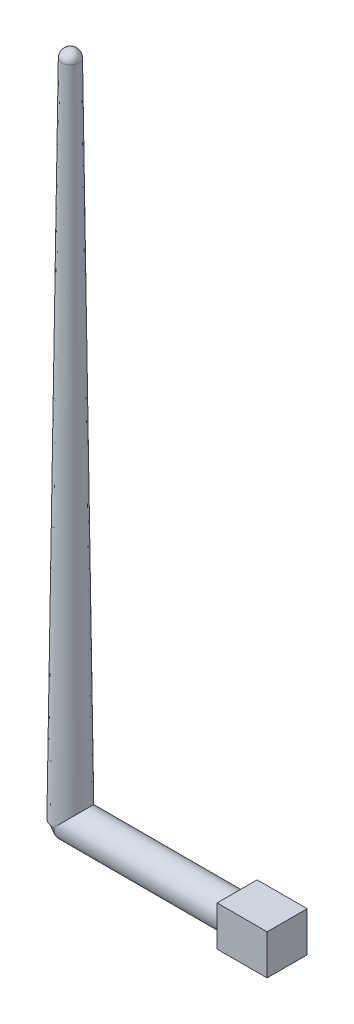
ISO-10303-21;
HEADER;
FILE_DESCRIPTION(('STEP AP214'),'2;1');
FILE_NAME('part.step','',(''),(''),'','','');
FILE_SCHEMA(('AUTOMOTIVE_DESIGN { 1 0 10303 214 1 1 1 1 }'));
ENDSEC;
DATA;
#1=APPLICATION_CONTEXT('core data for automotive mechanical design processes');
#2=APPLICATION_PROTOCOL_DEFINITION('international standard','automotive_design',2000,#1);
#3=PRODUCT_CONTEXT('',#1,'mechanical');
#4=PRODUCT('Part','Part','',(#3));
#5=PRODUCT_RELATED_PRODUCT_CATEGORY('part','',(#4));
#6=PRODUCT_DEFINITION_FORMATION('','',#4);
#7=PRODUCT_DEFINITION_CONTEXT('part definition',#1,'design');
#8=PRODUCT_DEFINITION('design','',#6,#7);
#9=PRODUCT_DEFINITION_SHAPE('','',#8);
#10=(LENGTH_UNIT() NAMED_UNIT(*) SI_UNIT(.MILLI.,.METRE.));
#11=(NAMED_UNIT(*) PLANE_ANGLE_UNIT() SI_UNIT($,.RADIAN.));
#12=(NAMED_UNIT(*) SI_UNIT($,.STERADIAN.) SOLID_ANGLE_UNIT());
#13=UNCERTAINTY_MEASURE_WITH_UNIT(LENGTH_MEASURE(1.E-05),#10,'distance_accuracy_value','');
#14=(GEOMETRIC_REPRESENTATION_CONTEXT(3) GLOBAL_UNCERTAINTY_ASSIGNED_CONTEXT((#13)) GLOBAL_UNIT_ASSIGNED_CONTEXT((#10,
#11,#12)) REPRESENTATION_CONTEXT('',''));
#15=CARTESIAN_POINT('',(0.,0.,0.));
#16=DIRECTION('',(0.,0.,1.));
#17=DIRECTION('',(1.,0.,0.));
#18=AXIS2_PLACEMENT_3D('',#15,#16,#17);
#19=CARTESIAN_POINT('',(0.,0.,0.));
#20=DIRECTION('',(0.,-1.,0.));
#21=DIRECTION('',(0.,0.,-1.));
#22=AXIS2_PLACEMENT_3D('',#19,#20,#21);
#23=PLANE('',#22);
#24=CARTESIAN_POINT('',(2.48223598092569,0.,-2.48223598092566));
#25=DIRECTION('',(0.,-1.,0.));
#26=DIRECTION('',(0.,0.,-1.));
#27=AXIS2_PLACEMENT_3D('',#24,#25,#26);
#28=CIRCLE('',#27,7.88323225201824);
#29=CARTESIAN_POINT('',(0.,0.,5.));
#30=VERTEX_POINT('',#29);
#31=CARTESIAN_POINT('',(-5.,0.,0.));
#32=VERTEX_POINT('',#31);
#33=EDGE_CURVE('E126',#30,#32,#28,.T.);
#34=ORIENTED_EDGE('',*,*,#33,.F.);
#35=CARTESIAN_POINT('',(0.,0.,0.));
#36=DIRECTION('',(0.,1.,0.));
#37=DIRECTION('',(0.,0.,1.));
#38=AXIS2_PLACEMENT_3D('',#35,#36,#37);
#39=CIRCLE('',#38,5.);
#40=EDGE_CURVE('E185',#32,#30,#39,.T.);
#41=ORIENTED_EDGE('',*,*,#40,.F.);
#42=EDGE_LOOP('',(#34,#41));
#43=FACE_BOUND('',#42,.T.);
#44=ADVANCED_FACE('F41',(#43),#23,.T.);
#45=CARTESIAN_POINT('',(2.48223598092569,0.,2.48223598092566));
#46=DIRECTION('',(0.,-1.,0.));
#47=DIRECTION('',(0.,0.,-1.));
#48=AXIS2_PLACEMENT_3D('',#45,#46,#47);
#49=CIRCLE('',#48,7.88323225201824);
#50=CARTESIAN_POINT('',(0.,0.,-5.));
#51=VERTEX_POINT('',#50);
#52=EDGE_CURVE('E63',#32,#51,#49,.T.);
#53=ORIENTED_EDGE('',*,*,#52,.F.);
#54=EDGE_CURVE('E188',#51,#32,#39,.T.);
#55=ORIENTED_EDGE('',*,*,#54,.F.);
#56=EDGE_LOOP('',(#53,#55));
#57=FACE_BOUND('',#56,.T.);
#58=ADVANCED_FACE('F213',(#57),#23,.T.);
#59=CARTESIAN_POINT('',(0.,200.,0.));
#60=DIRECTION('',(0.,-1.,0.));
#61=DIRECTION('',(0.,0.,-1.));
#62=AXIS2_PLACEMENT_3D('',#59,#60,#61);
#63=CONICAL_SURFACE('',#62,2.54,0.0122993797673);
#64=CARTESIAN_POINT('',(0.,0.,0.));
#65=DIRECTION('',(1.,0.,0.));
#66=DIRECTION('',(0.,0.,-1.));
#67=AXIS2_PLACEMENT_3D('',#64,#65,#66);
#68=CIRCLE('',#67,5.);
#69=CARTESIAN_POINT('',(0.,0.122981394144885,-4.99848732885202));
#70=VERTEX_POINT('',#69);
#71=EDGE_CURVE('E195',#51,#70,#68,.T.);
#72=ORIENTED_EDGE('',*,*,#71,.F.);
#73=ORIENTED_EDGE('',*,*,#54,.T.);
#74=ORIENTED_EDGE('',*,*,#40,.T.);
#75=CARTESIAN_POINT('',(0.,0.,0.));
#76=DIRECTION('',(1.,0.,0.));
#77=DIRECTION('',(0.,0.0245962788289719,0.999697465770404));
#78=AXIS2_PLACEMENT_3D('',#75,#76,#77);
#79=CIRCLE('',#78,5.);
#80=CARTESIAN_POINT('',(0.,0.122981394144859,4.99848732885202));
#81=VERTEX_POINT('',#80);
#82=EDGE_CURVE('E140',#81,#30,#79,.T.);
#83=ORIENTED_EDGE('',*,*,#82,.F.);
#84=CARTESIAN_POINT('',(-0.000200000000006043,0.122981719347298,-4.99848732085082));
#85=CARTESIAN_POINT('',(0.0041140445602933,0.122941983784983,-4.99848814322598));
#86=CARTESIAN_POINT('',(0.00838669636718358,0.12340649748179,-4.99847688084989));
#87=CARTESIAN_POINT('',(0.0166819601450323,0.125084695364693,-4.99843524774371));
#88=CARTESIAN_POINT('',(0.0207081143651078,0.126280091529975,-4.99840534312943));
#89=CARTESIAN_POINT('',(0.0333185341909606,0.130942278224027,-4.9982860329775));
#90=CARTESIAN_POINT('',(0.0415058955982765,0.135405167675584,-4.998168458391));
#91=CARTESIAN_POINT('',(0.0573815554873774,0.145379221564773,-4.99788877541384));
#92=CARTESIAN_POINT('',(0.065054583957373,0.150911611315367,-4.99772572923533));
#93=CARTESIAN_POINT('',(0.106061050706761,0.181976608672051,-4.99674990566785));
#94=CARTESIAN_POINT('',(0.136799886588813,0.210797360115552,-4.99563263966985));
#95=CARTESIAN_POINT('',(0.197533420119837,0.268392247711923,-4.99287957768969));
#96=CARTESIAN_POINT('',(0.227532376144431,0.29716433459216,-4.99124868973443));
#97=CARTESIAN_POINT('',(0.317047628560274,0.383930204072686,-4.98556895073764));
#98=CARTESIAN_POINT('',(0.376112493807718,0.442401642013323,-4.98073218973469));
#99=CARTESIAN_POINT('',(0.494047905902902,0.559322637435371,-4.96896873526236));
#100=CARTESIAN_POINT('',(0.552918373087558,0.617772178903973,-4.9620412719921));
#101=CARTESIAN_POINT('',(0.729688697256355,0.793561330565128,-4.93804145925127));
#102=CARTESIAN_POINT('',(0.847240097874623,0.910840139411898,-4.9177839840995));
#103=CARTESIAN_POINT('',(1.14291791206996,1.20595321290946,-4.85581065316292));
#104=CARTESIAN_POINT('',(1.32042966649146,1.38323775372208,-4.8084125663725));
#105=CARTESIAN_POINT('',(1.67215899456969,1.73463205393067,-4.69310772608639));
#106=CARTESIAN_POINT('',(1.8463743946256,1.90873971598349,-4.62518790933851));
#107=CARTESIAN_POINT('',(2.18979241000591,2.25197651883751,-4.46813054101986));
#108=CARTESIAN_POINT('',(2.35899974020133,2.42111034125612,-4.379013709416));
#109=CARTESIAN_POINT('',(2.69059197777311,2.75257831761949,-4.17861129304215));
#110=CARTESIAN_POINT('',(2.85298167610991,2.91491724629488,-4.06734160256204));
#111=CARTESIAN_POINT('',(3.20482291008086,3.26665884021091,-3.79333372799244));
#112=CARTESIAN_POINT('',(3.39199740520828,3.45378754010546,-3.62464488751588));
#113=CARTESIAN_POINT('',(3.74664746457296,3.80835811818785,-3.250036257335));
#114=CARTESIAN_POINT('',(3.91415188460505,3.97582883427959,-3.04417215842336));
#115=CARTESIAN_POINT('',(4.19170401168695,4.25332829124094,-2.63770631935502));
#116=CARTESIAN_POINT('',(4.3066004803321,4.36820420451485,-2.44376757398771));
#117=CARTESIAN_POINT('',(4.51267260937323,4.57424070809564,-2.03202055952493));
#118=CARTESIAN_POINT('',(4.60387645609127,4.66542947819809,-1.81424109564341));
#119=CARTESIAN_POINT('',(4.7435281608792,4.80505857034145,-1.39690899174952));
#120=CARTESIAN_POINT('',(4.79658845550159,4.85811048690934,-1.20045709438758));
#121=CARTESIAN_POINT('',(4.87870912899141,4.94021831437463,-0.797730289329045));
#122=CARTESIAN_POINT('',(4.90778479306362,4.96928950798642,-0.59146172651254));
#123=CARTESIAN_POINT('',(4.93985647171554,5.00135625988376,-0.1741904778181));
#124=CARTESIAN_POINT('',(4.94276980580195,5.00426915040211,0.0368251053600531));
#125=CARTESIAN_POINT('',(4.92206590997938,4.9835684295099,0.456227105175929));
#126=CARTESIAN_POINT('',(4.89844544153828,4.95995158006308,0.664613197736757));
#127=CARTESIAN_POINT('',(4.82817934549173,4.88969641717508,1.06296395774002));
#128=CARTESIAN_POINT('',(4.7826631609007,4.84418736586695,1.2533343266895));
#129=CARTESIAN_POINT('',(4.67193329788475,4.7334752469146,1.62214457622653));
#130=CARTESIAN_POINT('',(4.60671277518229,4.66826533620128,1.80058028497855));
#131=CARTESIAN_POINT('',(4.43123299124523,4.49281495947956,2.20937792531788));
#132=CARTESIAN_POINT('',(4.3133081539619,4.37491049500377,2.43316850699305));
#133=CARTESIAN_POINT('',(4.05338507545574,4.11503516862001,2.8508473808318));
#134=CARTESIAN_POINT('',(3.91133263725057,3.97301012557591,3.04466643405673));
#135=CARTESIAN_POINT('',(3.55301982837506,3.61477219979446,3.46941108336436));
#136=CARTESIAN_POINT('',(3.32888110247597,3.39068464452797,3.68708476712106));
#137=CARTESIAN_POINT('',(2.97700250761769,3.03890216909053,3.97340949473163));
#138=CARTESIAN_POINT('',(2.85701842864826,2.91895338514536,4.06219610558361));
#139=CARTESIAN_POINT('',(2.61273149844568,2.67474670527849,4.22698475342296));
#140=CARTESIAN_POINT('',(2.48842994106424,2.55049010033498,4.30299058131581));
#141=CARTESIAN_POINT('',(2.21746103646714,2.27963309911218,4.45317202216251));
#142=CARTESIAN_POINT('',(2.07024253026037,2.13248383611154,4.5253515711058));
#143=CARTESIAN_POINT('',(1.77258301037465,1.83499996354148,4.65392249355752));
#144=CARTESIAN_POINT('',(1.62214614072658,1.68466945263182,4.71033299266289));
#145=CARTESIAN_POINT('',(1.36994056325408,1.43269895816292,4.79150355699552));
#146=CARTESIAN_POINT('',(1.26885471331103,1.33172221791742,4.82052344759197));
#147=CARTESIAN_POINT('',(1.06581522808148,1.12898962412428,4.87199414313214));
#148=CARTESIAN_POINT('',(0.963861657187657,1.02723382844488,4.89444543122559));
#149=CARTESIAN_POINT('',(0.737371795385701,0.801286544026099,4.93698366150452));
#150=CARTESIAN_POINT('',(0.612675625640255,0.676957594021146,4.95553431863267));
#151=CARTESIAN_POINT('',(0.41635848582831,0.482263481409397,4.97719467357601));
#152=CARTESIAN_POINT('',(0.345116156820809,0.411823768565779,4.98351247597195));
#153=CARTESIAN_POINT('',(0.234249767287135,0.303419381932579,4.99092966312497));
#154=CARTESIAN_POINT('',(0.194964560247005,0.265238707027906,4.99309586220499));
#155=CARTESIAN_POINT('',(0.137728799229664,0.212237376701007,4.9955197716541));
#156=CARTESIAN_POINT('',(0.120484373498714,0.19659516919411,4.99615903239712));
#157=CARTESIAN_POINT('',(0.0852273673304535,0.166043438785533,4.99726347339379));
#158=CARTESIAN_POINT('',(0.0672175674952551,0.151131627166314,4.99772923228561));
#159=CARTESIAN_POINT('',(0.0428735795194714,0.136385808902271,4.99814043154836));
#160=CARTESIAN_POINT('',(0.0383096505254912,0.1338237624771,4.99820935095564));
#161=CARTESIAN_POINT('',(0.0289228218526764,0.129314547386976,4.99832796174257));
#162=CARTESIAN_POINT('',(0.0241027920371122,0.127361772298329,4.99837782945171));
#163=CARTESIAN_POINT('',(0.0160243343780858,0.124967522020881,4.99843816686954));
#164=CARTESIAN_POINT('',(0.0128556607294104,0.124233977356465,4.99845639570857));
#165=CARTESIAN_POINT('',(0.00639643931614668,0.123226316127475,4.99848130532602));
#166=CARTESIAN_POINT('',(0.00310475477225326,0.122959691135252,4.99848779785125));
#167=CARTESIAN_POINT('',(-0.000199999999995235,0.122981719347261,4.99848732085082));
#168=B_SPLINE_CURVE_WITH_KNOTS('',3,(#84,#85,#86,#87,#88,#89,#90,#91,#92,#93,#94,#95,#96,#97,
#98,#99,#100,#101,#102,#103,#104,#105,#106,#107,#108,#109,#110,#111,#112,#113,#114,#115,#116,
#117,#118,#119,#120,#121,#122,#123,#124,#125,#126,#127,#128,#129,#130,#131,#132,#133,#134,#135,
#136,#137,#138,#139,#140,#141,#142,#143,#144,#145,#146,#147,#148,#149,#150,#151,#152,#153,#154,
#155,#156,#157,#158,#159,#160,#161,#162,#163,#164,#165,#166,#167),.UNSPECIFIED.,.F.,.F.,(4,2,2,
2,2,2,2,2,2,2,2,2,2,2,2,2,2,2,2,2,2,2,2,2,2,2,2,2,2,2,2,2,2,2,2,2,2,2,2,2,2,4),(0.,
0.0128481830936474,0.0253873374970204,0.0531411420233546,0.0815160839308291,0.207570707881174,
0.332455579635894,0.582101530508303,0.831839513911602,1.3334553058012,2.09855049570579,
2.86413374210565,3.62897168839976,4.39326284167835,5.33190136974665,6.26914525250655,
7.02536977591996,7.7806904810061,8.40889430793168,9.0366974758317,9.66648398691781,
10.2963473737348,10.8967298826848,11.4973211739906,12.3299411560726,13.1644567750632,
14.3112291488093,14.8853294876078,15.4592592411012,16.1195437166037,16.7790238522978,
17.2162708954017,17.6534857689631,18.1843425901909,18.4855218241634,18.64988046091,
18.719837201897,18.7895584989702,18.8052383978377,18.8207694398604,18.8304950133254,
18.840375247949),.UNSPECIFIED.);
#169=EDGE_CURVE('E56',#70,#81,#168,.T.);
#170=ORIENTED_EDGE('',*,*,#169,.F.);
#171=EDGE_LOOP('',(#72,#73,#74,#83,#170));
#172=FACE_BOUND('',#171,.T.);
#173=CARTESIAN_POINT('',(0.,197.491239636967,0.));
#174=DIRECTION('',(0.,1.,0.));
#175=DIRECTION('',(0.,0.,1.));
#176=AXIS2_PLACEMENT_3D('',#173,#174,#175);
#177=CIRCLE('',#176,2.57085775246531);
#178=CARTESIAN_POINT('',(0.,197.491239636967,2.57085775246531));
#179=VERTEX_POINT('',#178);
#180=EDGE_CURVE('E197',#179,#179,#177,.F.);
#181=ORIENTED_EDGE('',*,*,#180,.T.);
#182=EDGE_LOOP('',(#181));
#183=FACE_BOUND('',#182,.T.);
#184=ADVANCED_FACE('F203',(#172,#183),#63,.T.);
#185=CARTESIAN_POINT('',(-2.54,200.,0.));
#186=DIRECTION('',(0.,1.,0.));
#187=DIRECTION('',(0.,0.,1.));
#188=AXIS2_PLACEMENT_3D('',#185,#186,#187);
#189=PLANE('',#188);
#190=CARTESIAN_POINT('',(0.,200.,0.));
#191=DIRECTION('',(0.,1.,0.));
#192=DIRECTION('',(0.,0.,1.));
#193=AXIS2_PLACEMENT_3D('',#190,#191,#192);
#194=CIRCLE('',#193,0.031049868966601);
#195=CARTESIAN_POINT('',(0.,200.,0.031049868966601));
#196=VERTEX_POINT('',#195);
#197=EDGE_CURVE('E182',#196,#196,#194,.T.);
#198=ORIENTED_EDGE('',*,*,#197,.T.);
#199=EDGE_LOOP('',(#198));
#200=FACE_BOUND('',#199,.T.);
#201=ADVANCED_FACE('F212',(#200),#189,.T.);
#202=CARTESIAN_POINT('',(0.,197.46,0.));
#203=DIRECTION('',(0.,1.,0.));
#204=DIRECTION('',(0.,0.,1.));
#205=AXIS2_PLACEMENT_3D('',#202,#203,#204);
#206=DEGENERATE_TOROIDAL_SURFACE('',#205,0.031049868966601,2.54,.T.);
#207=ORIENTED_EDGE('',*,*,#180,.F.);
#208=EDGE_LOOP('',(#207));
#209=FACE_BOUND('',#208,.T.);
#210=ORIENTED_EDGE('',*,*,#197,.F.);
#211=EDGE_LOOP('',(#210));
#212=FACE_BOUND('',#211,.T.);
#213=ADVANCED_FACE('F217',(#209,#212),#206,.T.);
#214=CARTESIAN_POINT('',(2.48223598092569,0.,-2.48223598092566));
#215=DIRECTION('',(0.,-1.,0.));
#216=DIRECTION('',(0.,0.,1.));
#217=AXIS2_PLACEMENT_3D('',#214,#215,#216);
#218=CIRCLE('',#217,7.88323225201824);
#219=TRIMMED_CURVE('',#218,(PARAMETER_VALUE(-1.25047094364512)),
(PARAMETER_VALUE(1.25047094364512)),.T.,.PARAMETER.);
#220=CARTESIAN_POINT('',(2.48223598092569,0.,0.));
#221=DIRECTION('',(-1.,0.,0.));
#222=AXIS1_PLACEMENT('',#220,#221);
#223=SURFACE_OF_REVOLUTION('',#219,#222);
#224=ORIENTED_EDGE('',*,*,#33,.T.);
#225=ORIENTED_EDGE('',*,*,#52,.T.);
#226=CARTESIAN_POINT('',(0.,0.,0.));
#227=DIRECTION('',(-1.,0.,0.));
#228=DIRECTION('',(0.,0.,1.));
#229=AXIS2_PLACEMENT_3D('',#226,#227,#228);
#230=CIRCLE('',#229,5.);
#231=EDGE_CURVE('E123',#51,#30,#230,.T.);
#232=ORIENTED_EDGE('',*,*,#231,.T.);
#233=EDGE_LOOP('',(#224,#225,#232));
#234=FACE_BOUND('',#233,.T.);
#235=ADVANCED_FACE('F157',(#234),#223,.T.);
#236=CARTESIAN_POINT('',(0.,0.,0.));
#237=DIRECTION('',(-1.,0.,0.));
#238=DIRECTION('',(0.,0.,1.));
#239=AXIS2_PLACEMENT_3D('',#236,#237,#238);
#240=CYLINDRICAL_SURFACE('',#239,5.);
#241=CARTESIAN_POINT('',(49.5,0.,0.));
#242=DIRECTION('',(1.,0.,0.));
#243=DIRECTION('',(0.,0.,-1.));
#244=AXIS2_PLACEMENT_3D('',#241,#242,#243);
#245=CIRCLE('',#244,5.);
#246=CARTESIAN_POINT('',(49.5,0.,-5.));
#247=VERTEX_POINT('',#246);
#248=EDGE_CURVE('E49',#247,#247,#245,.F.);
#249=ORIENTED_EDGE('',*,*,#248,.T.);
#250=EDGE_LOOP('',(#249));
#251=FACE_BOUND('',#250,.T.);
#252=ORIENTED_EDGE('',*,*,#71,.T.);
#253=ORIENTED_EDGE('',*,*,#169,.T.);
#254=ORIENTED_EDGE('',*,*,#82,.T.);
#255=ORIENTED_EDGE('',*,*,#231,.F.);
#256=EDGE_LOOP('',(#252,#253,#254,#255));
#257=FACE_BOUND('',#256,.T.);
#258=ADVANCED_FACE('F147',(#251,#257),#240,.T.);
#259=CARTESIAN_POINT('',(65.,6.,-6.));
#260=DIRECTION('',(0.,0.,1.));
#261=DIRECTION('',(0.,-1.,0.));
#262=AXIS2_PLACEMENT_3D('',#259,#260,#261);
#263=PLANE('',#262);
#264=DIRECTION('',(0.,1.,0.));
#265=VECTOR('',#264,1.);
#266=CARTESIAN_POINT('',(50.,6.,-6.));
#267=LINE('',#266,#265);
#268=CARTESIAN_POINT('',(50.,-6.,-6.));
#269=VERTEX_POINT('',#268);
#270=CARTESIAN_POINT('',(50.,6.,-6.));
#271=VERTEX_POINT('',#270);
#272=EDGE_CURVE('E122',#269,#271,#267,.T.);
#273=ORIENTED_EDGE('',*,*,#272,.T.);
#274=DIRECTION('',(-1.,0.,0.));
#275=VECTOR('',#274,1.);
#276=CARTESIAN_POINT('',(65.,6.,-6.));
#277=LINE('',#276,#275);
#278=CARTESIAN_POINT('',(65.,6.,-6.));
#279=VERTEX_POINT('',#278);
#280=EDGE_CURVE('E102',#279,#271,#277,.T.);
#281=ORIENTED_EDGE('',*,*,#280,.F.);
#282=DIRECTION('',(0.,1.,0.));
#283=VECTOR('',#282,1.);
#284=CARTESIAN_POINT('',(65.,6.,-6.));
#285=LINE('',#284,#283);
#286=CARTESIAN_POINT('',(65.,-6.,-6.));
#287=VERTEX_POINT('',#286);
#288=EDGE_CURVE('E109',#287,#279,#285,.T.);
#289=ORIENTED_EDGE('',*,*,#288,.F.);
#290=DIRECTION('',(-1.,0.,0.));
#291=VECTOR('',#290,1.);
#292=CARTESIAN_POINT('',(65.,-6.,-6.));
#293=LINE('',#292,#291);
#294=EDGE_CURVE('E336',#287,#269,#293,.T.);
#295=ORIENTED_EDGE('',*,*,#294,.T.);
#296=EDGE_LOOP('',(#273,#281,#289,#295));
#297=FACE_BOUND('',#296,.T.);
#298=ADVANCED_FACE('F120',(#297),#263,.F.);
#299=CARTESIAN_POINT('',(65.,6.,6.));
#300=DIRECTION('',(0.,-1.,0.));
#301=DIRECTION('',(0.,0.,-1.));
#302=AXIS2_PLACEMENT_3D('',#299,#300,#301);
#303=PLANE('',#302);
#304=DIRECTION('',(0.,0.,1.));
#305=VECTOR('',#304,1.);
#306=CARTESIAN_POINT('',(50.,6.,6.));
#307=LINE('',#306,#305);
#308=CARTESIAN_POINT('',(50.,6.,6.));
#309=VERTEX_POINT('',#308);
#310=EDGE_CURVE('E327',#271,#309,#307,.T.);
#311=ORIENTED_EDGE('',*,*,#310,.T.);
#312=DIRECTION('',(-1.,0.,0.));
#313=VECTOR('',#312,1.);
#314=CARTESIAN_POINT('',(65.,6.,6.));
#315=LINE('',#314,#313);
#316=CARTESIAN_POINT('',(65.,6.,6.));
#317=VERTEX_POINT('',#316);
#318=EDGE_CURVE('E105',#317,#309,#315,.T.);
#319=ORIENTED_EDGE('',*,*,#318,.F.);
#320=DIRECTION('',(0.,0.,1.));
#321=VECTOR('',#320,1.);
#322=CARTESIAN_POINT('',(65.,6.,6.));
#323=LINE('',#322,#321);
#324=EDGE_CURVE('E98',#279,#317,#323,.T.);
#325=ORIENTED_EDGE('',*,*,#324,.F.);
#326=ORIENTED_EDGE('',*,*,#280,.T.);
#327=EDGE_LOOP('',(#311,#319,#325,#326));
#328=FACE_BOUND('',#327,.T.);
#329=ADVANCED_FACE('F100',(#328),#303,.F.);
#330=CARTESIAN_POINT('',(65.,6.,6.));
#331=DIRECTION('',(0.,0.,-1.));
#332=DIRECTION('',(0.,1.,0.));
#333=AXIS2_PLACEMENT_3D('',#330,#331,#332);
#334=PLANE('',#333);
#335=DIRECTION('',(0.,-1.,0.));
#336=VECTOR('',#335,1.);
#337=CARTESIAN_POINT('',(50.,6.,6.));
#338=LINE('',#337,#336);
#339=CARTESIAN_POINT('',(50.,-6.,6.));
#340=VERTEX_POINT('',#339);
#341=EDGE_CURVE('E329',#309,#340,#338,.T.);
#342=ORIENTED_EDGE('',*,*,#341,.T.);
#343=DIRECTION('',(-1.,0.,0.));
#344=VECTOR('',#343,1.);
#345=CARTESIAN_POINT('',(65.,-6.,6.));
#346=LINE('',#345,#344);
#347=CARTESIAN_POINT('',(65.,-6.,6.));
#348=VERTEX_POINT('',#347);
#349=EDGE_CURVE('E128',#348,#340,#346,.T.);
#350=ORIENTED_EDGE('',*,*,#349,.F.);
#351=DIRECTION('',(0.,-1.,0.));
#352=VECTOR('',#351,1.);
#353=CARTESIAN_POINT('',(65.,6.,6.));
#354=LINE('',#353,#352);
#355=EDGE_CURVE('E108',#317,#348,#354,.T.);
#356=ORIENTED_EDGE('',*,*,#355,.F.);
#357=ORIENTED_EDGE('',*,*,#318,.T.);
#358=EDGE_LOOP('',(#342,#350,#356,#357));
#359=FACE_BOUND('',#358,.T.);
#360=ADVANCED_FACE('F266',(#359),#334,.F.);
#361=CARTESIAN_POINT('',(65.,-6.,6.));
#362=DIRECTION('',(0.,1.,0.));
#363=DIRECTION('',(0.,0.,1.));
#364=AXIS2_PLACEMENT_3D('',#361,#362,#363);
#365=PLANE('',#364);
#366=DIRECTION('',(0.,0.,-1.));
#367=VECTOR('',#366,1.);
#368=CARTESIAN_POINT('',(50.,-6.,6.));
#369=LINE('',#368,#367);
#370=EDGE_CURVE('E118',#340,#269,#369,.T.);
#371=ORIENTED_EDGE('',*,*,#370,.T.);
#372=ORIENTED_EDGE('',*,*,#294,.F.);
#373=DIRECTION('',(0.,0.,-1.));
#374=VECTOR('',#373,1.);
#375=CARTESIAN_POINT('',(65.,-6.,6.));
#376=LINE('',#375,#374);
#377=EDGE_CURVE('E114',#348,#287,#376,.T.);
#378=ORIENTED_EDGE('',*,*,#377,.F.);
#379=ORIENTED_EDGE('',*,*,#349,.T.);
#380=EDGE_LOOP('',(#371,#372,#378,#379));
#381=FACE_BOUND('',#380,.T.);
#382=ADVANCED_FACE('F273',(#381),#365,.F.);
#383=CARTESIAN_POINT('',(65.,0.,0.));
#384=DIRECTION('',(1.,0.,0.));
#385=DIRECTION('',(0.,0.,-1.));
#386=AXIS2_PLACEMENT_3D('',#383,#384,#385);
#387=PLANE('',#386);
#388=ORIENTED_EDGE('',*,*,#288,.T.);
#389=ORIENTED_EDGE('',*,*,#324,.T.);
#390=ORIENTED_EDGE('',*,*,#355,.T.);
#391=ORIENTED_EDGE('',*,*,#377,.T.);
#392=EDGE_LOOP('',(#388,#389,#390,#391));
#393=FACE_BOUND('',#392,.T.);
#394=ADVANCED_FACE('F112',(#393),#387,.T.);
#395=CARTESIAN_POINT('',(50.,0.,0.));
#396=DIRECTION('',(1.,0.,0.));
#397=DIRECTION('',(0.,0.,-1.));
#398=AXIS2_PLACEMENT_3D('',#395,#396,#397);
#399=PLANE('',#398);
#400=CARTESIAN_POINT('',(50.,0.,0.));
#401=DIRECTION('',(1.,0.,0.));
#402=DIRECTION('',(0.,0.,-1.));
#403=AXIS2_PLACEMENT_3D('',#400,#401,#402);
#404=CIRCLE('',#403,5.5);
#405=CARTESIAN_POINT('',(50.,0.,-5.5));
#406=VERTEX_POINT('',#405);
#407=EDGE_CURVE('E11',#406,#406,#404,.T.);
#408=ORIENTED_EDGE('',*,*,#407,.T.);
#409=EDGE_LOOP('',(#408));
#410=FACE_BOUND('',#409,.T.);
#411=ORIENTED_EDGE('',*,*,#272,.F.);
#412=ORIENTED_EDGE('',*,*,#370,.F.);
#413=ORIENTED_EDGE('',*,*,#341,.F.);
#414=ORIENTED_EDGE('',*,*,#310,.F.);
#415=EDGE_LOOP('',(#411,#412,#413,#414));
#416=FACE_BOUND('',#415,.T.);
#417=ADVANCED_FACE('F289',(#410,#416),#399,.F.);
#418=CARTESIAN_POINT('',(49.5,0.,0.));
#419=DIRECTION('',(1.,0.,0.));
#420=DIRECTION('',(0.,0.,-1.));
#421=AXIS2_PLACEMENT_3D('',#418,#419,#420);
#422=TOROIDAL_SURFACE('',#421,5.5,0.5);
#423=ORIENTED_EDGE('',*,*,#407,.F.);
#424=EDGE_LOOP('',(#423));
#425=FACE_BOUND('',#424,.T.);
#426=ORIENTED_EDGE('',*,*,#248,.F.);
#427=EDGE_LOOP('',(#426));
#428=FACE_BOUND('',#427,.T.);
#429=ADVANCED_FACE('F43',(#425,#428),#422,.F.);
#430=CLOSED_SHELL('',(#44,#58,#184,#201,#213,#235,#258,#298,#329,#360,#382,#394,#417,#429));
#431=MANIFOLD_SOLID_BREP('B2',#430);
#432=ADVANCED_BREP_SHAPE_REPRESENTATION('',(#18,#431),#14);
#433=SHAPE_DEFINITION_REPRESENTATION(#9,#432);
ENDSEC;
END-ISO-10303-21;
